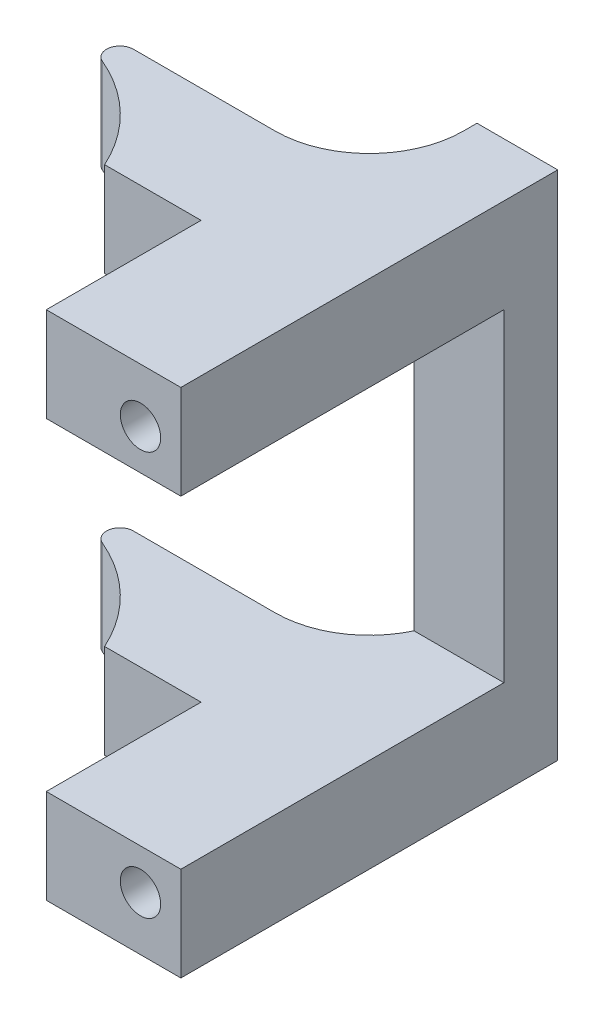
ISO-10303-21;
HEADER;
FILE_DESCRIPTION(('STEP AP214'),'2;1');
FILE_NAME('part.step','',(''),(''),'','','');
FILE_SCHEMA(('AUTOMOTIVE_DESIGN { 1 0 10303 214 1 1 1 1 }'));
ENDSEC;
DATA;
#1=APPLICATION_CONTEXT('core data for automotive mechanical design processes');
#2=APPLICATION_PROTOCOL_DEFINITION('international standard','automotive_design',2000,#1);
#3=PRODUCT_CONTEXT('',#1,'mechanical');
#4=PRODUCT('Part','Part','',(#3));
#5=PRODUCT_RELATED_PRODUCT_CATEGORY('part','',(#4));
#6=PRODUCT_DEFINITION_FORMATION('','',#4);
#7=PRODUCT_DEFINITION_CONTEXT('part definition',#1,'design');
#8=PRODUCT_DEFINITION('design','',#6,#7);
#9=PRODUCT_DEFINITION_SHAPE('','',#8);
#10=(LENGTH_UNIT() NAMED_UNIT(*) SI_UNIT(.MILLI.,.METRE.));
#11=(NAMED_UNIT(*) PLANE_ANGLE_UNIT() SI_UNIT($,.RADIAN.));
#12=(NAMED_UNIT(*) SI_UNIT($,.STERADIAN.) SOLID_ANGLE_UNIT());
#13=UNCERTAINTY_MEASURE_WITH_UNIT(LENGTH_MEASURE(1.E-05),#10,'distance_accuracy_value','');
#14=(GEOMETRIC_REPRESENTATION_CONTEXT(3) GLOBAL_UNCERTAINTY_ASSIGNED_CONTEXT((#13)) GLOBAL_UNIT_ASSIGNED_CONTEXT((#10,
#11,#12)) REPRESENTATION_CONTEXT('',''));
#15=CARTESIAN_POINT('',(0.,0.,0.));
#16=DIRECTION('',(0.,0.,1.));
#17=DIRECTION('',(1.,0.,0.));
#18=AXIS2_PLACEMENT_3D('',#15,#16,#17);
#19=CARTESIAN_POINT('',(2.,34.,10.));
#20=DIRECTION('',(0.,0.,-1.));
#21=DIRECTION('',(1.,0.,0.));
#22=AXIS2_PLACEMENT_3D('',#19,#20,#21);
#23=CYLINDRICAL_SURFACE('',#22,1.5);
#24=CARTESIAN_POINT('',(2.,34.,10.));
#25=DIRECTION('',(0.,0.,1.));
#26=DIRECTION('',(-1.,0.,0.));
#27=AXIS2_PLACEMENT_3D('',#24,#25,#26);
#28=CIRCLE('',#27,1.5);
#29=CARTESIAN_POINT('',(0.499999999999993,34.,10.));
#30=VERTEX_POINT('',#29);
#31=EDGE_CURVE('E292',#30,#30,#28,.T.);
#32=ORIENTED_EDGE('',*,*,#31,.T.);
#33=EDGE_LOOP('',(#32));
#34=FACE_BOUND('',#33,.T.);
#35=CARTESIAN_POINT('',(2.,34.,-17.));
#36=DIRECTION('',(0.,0.,1.));
#37=DIRECTION('',(1.,0.,0.));
#38=AXIS2_PLACEMENT_3D('',#35,#36,#37);
#39=CIRCLE('',#38,1.5);
#40=CARTESIAN_POINT('',(3.5,34.,-17.));
#41=VERTEX_POINT('',#40);
#42=EDGE_CURVE('E41',#41,#41,#39,.F.);
#43=ORIENTED_EDGE('',*,*,#42,.T.);
#44=EDGE_LOOP('',(#43));
#45=FACE_BOUND('',#44,.T.);
#46=ADVANCED_FACE('F37',(#34,#45),#23,.F.);
#47=CARTESIAN_POINT('',(-19.5239351011286,31.,-10.));
#48=DIRECTION('',(0.,1.,0.));
#49=DIRECTION('',(0.,0.,-1.));
#50=AXIS2_PLACEMENT_3D('',#47,#48,#49);
#51=PLANE('',#50);
#52=DIRECTION('',(1.,0.,0.));
#53=VECTOR('',#52,1.);
#54=CARTESIAN_POINT('',(-1.,31.,-14.));
#55=LINE('',#54,#53);
#56=CARTESIAN_POINT('',(-1.67544467966325,31.,-14.));
#57=VERTEX_POINT('',#56);
#58=CARTESIAN_POINT('',(5.,31.,-14.));
#59=VERTEX_POINT('',#58);
#60=EDGE_CURVE('E256',#57,#59,#55,.T.);
#61=ORIENTED_EDGE('',*,*,#60,.T.);
#62=DIRECTION('',(0.,0.,-1.));
#63=VECTOR('',#62,1.);
#64=CARTESIAN_POINT('',(5.,31.,-10.));
#65=LINE('',#64,#63);
#66=CARTESIAN_POINT('',(5.,31.,10.));
#67=VERTEX_POINT('',#66);
#68=EDGE_CURVE('E305',#67,#59,#65,.T.);
#69=ORIENTED_EDGE('',*,*,#68,.F.);
#70=DIRECTION('',(1.,0.,0.));
#71=VECTOR('',#70,1.);
#72=CARTESIAN_POINT('',(-19.5239351011286,31.,10.));
#73=LINE('',#72,#71);
#74=CARTESIAN_POINT('',(-5.,31.,10.));
#75=VERTEX_POINT('',#74);
#76=EDGE_CURVE('E270',#75,#67,#73,.T.);
#77=ORIENTED_EDGE('',*,*,#76,.F.);
#78=DIRECTION('',(0.,0.,-1.));
#79=VECTOR('',#78,1.);
#80=CARTESIAN_POINT('',(-5.,31.,-10.));
#81=LINE('',#80,#79);
#82=CARTESIAN_POINT('',(-5.,31.,-1.5));
#83=VERTEX_POINT('',#82);
#84=EDGE_CURVE('E296',#75,#83,#81,.T.);
#85=ORIENTED_EDGE('',*,*,#84,.T.);
#86=DIRECTION('',(1.,0.,0.));
#87=VECTOR('',#86,1.);
#88=CARTESIAN_POINT('',(-5.,31.,-1.5));
#89=LINE('',#88,#87);
#90=CARTESIAN_POINT('',(-12.1670936190878,31.,-1.5));
#91=VERTEX_POINT('',#90);
#92=EDGE_CURVE('E267',#91,#83,#89,.T.);
#93=ORIENTED_EDGE('',*,*,#92,.F.);
#94=CARTESIAN_POINT('',(-23.999397259488,31.,3.8848482394002));
#95=DIRECTION('',(0.,-1.,0.));
#96=DIRECTION('',(0.,0.,-1.));
#97=AXIS2_PLACEMENT_3D('',#94,#95,#96);
#98=CIRCLE('',#97,13.);
#99=CARTESIAN_POINT('',(-18.9150395410114,31.,-8.0796536971857));
#100=VERTEX_POINT('',#99);
#101=EDGE_CURVE('E271',#100,#91,#98,.T.);
#102=ORIENTED_EDGE('',*,*,#101,.F.);
#103=CARTESIAN_POINT('',(-18.5239351011286,31.,-9.));
#104=DIRECTION('',(0.,-1.,0.));
#105=DIRECTION('',(0.,0.,-1.));
#106=AXIS2_PLACEMENT_3D('',#103,#104,#105);
#107=CIRCLE('',#106,1.);
#108=CARTESIAN_POINT('',(-18.5239351011286,31.,-10.));
#109=VERTEX_POINT('',#108);
#110=EDGE_CURVE('E275',#109,#100,#107,.F.);
#111=ORIENTED_EDGE('',*,*,#110,.F.);
#112=DIRECTION('',(1.,0.,0.));
#113=VECTOR('',#112,1.);
#114=CARTESIAN_POINT('',(-19.5239351011286,31.,-10.));
#115=LINE('',#114,#113);
#116=CARTESIAN_POINT('',(-8.00000000000002,31.,-10.));
#117=VERTEX_POINT('',#116);
#118=EDGE_CURVE('E306',#109,#117,#115,.T.);
#119=ORIENTED_EDGE('',*,*,#118,.T.);
#120=CARTESIAN_POINT('',(-8.00000000000001,31.,-17.));
#121=DIRECTION('',(0.,-1.,0.));
#122=DIRECTION('',(0.,0.,-1.));
#123=AXIS2_PLACEMENT_3D('',#120,#121,#122);
#124=CIRCLE('',#123,7.);
#125=EDGE_CURVE('E46',#57,#117,#124,.T.);
#126=ORIENTED_EDGE('',*,*,#125,.F.);
#127=EDGE_LOOP('',(#61,#69,#77,#85,#93,#102,#111,#119,#126));
#128=FACE_BOUND('',#127,.T.);
#129=ADVANCED_FACE('F365',(#128),#51,.F.);
#130=CARTESIAN_POINT('',(-5.,38.,-10.));
#131=DIRECTION('',(0.,0.,1.));
#132=DIRECTION('',(-1.,0.,0.));
#133=AXIS2_PLACEMENT_3D('',#130,#131,#132);
#134=PLANE('',#133);
#135=ORIENTED_EDGE('',*,*,#118,.F.);
#136=DIRECTION('',(0.,-1.,0.));
#137=VECTOR('',#136,1.);
#138=CARTESIAN_POINT('',(-18.5239351011286,54.8283894304178,-10.));
#139=LINE('',#138,#137);
#140=CARTESIAN_POINT('',(-18.5239351011286,38.,-10.));
#141=VERTEX_POINT('',#140);
#142=EDGE_CURVE('E310',#141,#109,#139,.T.);
#143=ORIENTED_EDGE('',*,*,#142,.F.);
#144=DIRECTION('',(1.,0.,0.));
#145=VECTOR('',#144,1.);
#146=CARTESIAN_POINT('',(-5.,38.,-10.));
#147=LINE('',#146,#145);
#148=CARTESIAN_POINT('',(-8.00000000000001,38.,-10.));
#149=VERTEX_POINT('',#148);
#150=EDGE_CURVE('E272',#141,#149,#147,.T.);
#151=ORIENTED_EDGE('',*,*,#150,.T.);
#152=DIRECTION('',(0.,1.,0.));
#153=VECTOR('',#152,1.);
#154=CARTESIAN_POINT('',(-8.00000000000001,34.5,-10.));
#155=LINE('',#154,#153);
#156=EDGE_CURVE('E324',#117,#149,#155,.T.);
#157=ORIENTED_EDGE('',*,*,#156,.F.);
#158=EDGE_LOOP('',(#135,#143,#151,#157));
#159=FACE_BOUND('',#158,.T.);
#160=ADVANCED_FACE('F371',(#159),#134,.F.);
#161=CARTESIAN_POINT('',(-5.,38.,-10.));
#162=DIRECTION('',(1.,0.,0.));
#163=DIRECTION('',(0.,0.,1.));
#164=AXIS2_PLACEMENT_3D('',#161,#162,#163);
#165=PLANE('',#164);
#166=DIRECTION('',(0.,-1.,0.));
#167=VECTOR('',#166,1.);
#168=CARTESIAN_POINT('',(-5.,38.,10.));
#169=LINE('',#168,#167);
#170=CARTESIAN_POINT('',(-5.,38.,10.));
#171=VERTEX_POINT('',#170);
#172=EDGE_CURVE('E266',#171,#75,#169,.T.);
#173=ORIENTED_EDGE('',*,*,#172,.F.);
#174=DIRECTION('',(0.,0.,-1.));
#175=VECTOR('',#174,1.);
#176=CARTESIAN_POINT('',(-5.,38.,-10.));
#177=LINE('',#176,#175);
#178=CARTESIAN_POINT('',(-5.,38.,-1.5));
#179=VERTEX_POINT('',#178);
#180=EDGE_CURVE('E277',#171,#179,#177,.T.);
#181=ORIENTED_EDGE('',*,*,#180,.T.);
#182=DIRECTION('',(0.,-1.,0.));
#183=VECTOR('',#182,1.);
#184=CARTESIAN_POINT('',(-5.,54.8283894304178,-1.5));
#185=LINE('',#184,#183);
#186=EDGE_CURVE('E286',#179,#83,#185,.T.);
#187=ORIENTED_EDGE('',*,*,#186,.T.);
#188=ORIENTED_EDGE('',*,*,#84,.F.);
#189=EDGE_LOOP('',(#173,#181,#187,#188));
#190=FACE_BOUND('',#189,.T.);
#191=ADVANCED_FACE('F394',(#190),#165,.F.);
#192=CARTESIAN_POINT('',(5.,38.,-10.));
#193=DIRECTION('',(-1.,0.,0.));
#194=DIRECTION('',(0.,0.,-1.));
#195=AXIS2_PLACEMENT_3D('',#192,#193,#194);
#196=PLANE('',#195);
#197=DIRECTION('',(0.,0.,1.));
#198=VECTOR('',#197,1.);
#199=CARTESIAN_POINT('',(5.,38.,-10.));
#200=LINE('',#199,#198);
#201=CARTESIAN_POINT('',(4.99999999999999,38.,-18.));
#202=VERTEX_POINT('',#201);
#203=CARTESIAN_POINT('',(5.,38.,10.));
#204=VERTEX_POINT('',#203);
#205=EDGE_CURVE('E283',#202,#204,#200,.T.);
#206=ORIENTED_EDGE('',*,*,#205,.T.);
#207=DIRECTION('',(0.,-1.,0.));
#208=VECTOR('',#207,1.);
#209=CARTESIAN_POINT('',(5.,38.,10.));
#210=LINE('',#209,#208);
#211=EDGE_CURVE('E295',#204,#67,#210,.T.);
#212=ORIENTED_EDGE('',*,*,#211,.T.);
#213=ORIENTED_EDGE('',*,*,#68,.T.);
#214=DIRECTION('',(0.,1.,0.));
#215=VECTOR('',#214,1.);
#216=CARTESIAN_POINT('',(5.,-0.211102550927982,-14.));
#217=LINE('',#216,#215);
#218=CARTESIAN_POINT('',(5.,6.99999999999999,-14.));
#219=VERTEX_POINT('',#218);
#220=EDGE_CURVE('E259',#219,#59,#217,.T.);
#221=ORIENTED_EDGE('',*,*,#220,.F.);
#222=DIRECTION('',(0.,0.,1.));
#223=VECTOR('',#222,1.);
#224=CARTESIAN_POINT('',(5.,6.99999999999999,-9.99999999999999));
#225=LINE('',#224,#223);
#226=CARTESIAN_POINT('',(5.,7.,10.));
#227=VERTEX_POINT('',#226);
#228=EDGE_CURVE('E179',#219,#227,#225,.T.);
#229=ORIENTED_EDGE('',*,*,#228,.T.);
#230=DIRECTION('',(0.,-1.,0.));
#231=VECTOR('',#230,1.);
#232=CARTESIAN_POINT('',(5.,38.,10.));
#233=LINE('',#232,#231);
#234=CARTESIAN_POINT('',(5.,0.,10.));
#235=VERTEX_POINT('',#234);
#236=EDGE_CURVE('E250',#227,#235,#233,.T.);
#237=ORIENTED_EDGE('',*,*,#236,.T.);
#238=DIRECTION('',(0.,0.,1.));
#239=VECTOR('',#238,1.);
#240=CARTESIAN_POINT('',(5.,0.,-10.));
#241=LINE('',#240,#239);
#242=CARTESIAN_POINT('',(5.,0.,-18.));
#243=VERTEX_POINT('',#242);
#244=EDGE_CURVE('E232',#243,#235,#241,.T.);
#245=ORIENTED_EDGE('',*,*,#244,.F.);
#246=DIRECTION('',(0.,1.,0.));
#247=VECTOR('',#246,1.);
#248=CARTESIAN_POINT('',(4.99999999999999,38.,-18.));
#249=LINE('',#248,#247);
#250=EDGE_CURVE('E188',#243,#202,#249,.T.);
#251=ORIENTED_EDGE('',*,*,#250,.T.);
#252=EDGE_LOOP('',(#206,#212,#213,#221,#229,#237,#245,#251));
#253=FACE_BOUND('',#252,.T.);
#254=ADVANCED_FACE('F398',(#253),#196,.F.);
#255=CARTESIAN_POINT('',(-5.,38.,10.));
#256=DIRECTION('',(0.,0.,-1.));
#257=DIRECTION('',(1.,0.,0.));
#258=AXIS2_PLACEMENT_3D('',#255,#256,#257);
#259=PLANE('',#258);
#260=ORIENTED_EDGE('',*,*,#31,.F.);
#261=EDGE_LOOP('',(#260));
#262=FACE_BOUND('',#261,.T.);
#263=ORIENTED_EDGE('',*,*,#211,.F.);
#264=DIRECTION('',(-1.,0.,0.));
#265=VECTOR('',#264,1.);
#266=CARTESIAN_POINT('',(-5.,38.,10.));
#267=LINE('',#266,#265);
#268=EDGE_CURVE('E281',#204,#171,#267,.T.);
#269=ORIENTED_EDGE('',*,*,#268,.T.);
#270=ORIENTED_EDGE('',*,*,#172,.T.);
#271=ORIENTED_EDGE('',*,*,#76,.T.);
#272=EDGE_LOOP('',(#263,#269,#270,#271));
#273=FACE_BOUND('',#272,.T.);
#274=ADVANCED_FACE('F390',(#262,#273),#259,.F.);
#275=CARTESIAN_POINT('',(-23.999397259488,54.8283894304178,3.8848482394002));
#276=DIRECTION('',(0.,-1.,0.));
#277=DIRECTION('',(0.,0.,1.));
#278=AXIS2_PLACEMENT_3D('',#275,#276,#277);
#279=CYLINDRICAL_SURFACE('',#278,13.);
#280=ORIENTED_EDGE('',*,*,#101,.T.);
#281=DIRECTION('',(0.,-1.,0.));
#282=VECTOR('',#281,1.);
#283=CARTESIAN_POINT('',(-12.1670936190878,54.8283894304178,-1.5));
#284=LINE('',#283,#282);
#285=CARTESIAN_POINT('',(-12.1670936190878,38.,-1.5));
#286=VERTEX_POINT('',#285);
#287=EDGE_CURVE('E309',#286,#91,#284,.T.);
#288=ORIENTED_EDGE('',*,*,#287,.F.);
#289=CARTESIAN_POINT('',(-23.999397259488,38.,3.8848482394002));
#290=DIRECTION('',(0.,1.,0.));
#291=DIRECTION('',(0.,0.,1.));
#292=AXIS2_PLACEMENT_3D('',#289,#290,#291);
#293=CIRCLE('',#292,13.);
#294=CARTESIAN_POINT('',(-18.9150395410114,38.,-8.0796536971857));
#295=VERTEX_POINT('',#294);
#296=EDGE_CURVE('E288',#286,#295,#293,.T.);
#297=ORIENTED_EDGE('',*,*,#296,.T.);
#298=DIRECTION('',(0.,-1.,0.));
#299=VECTOR('',#298,1.);
#300=CARTESIAN_POINT('',(-18.9150395410114,54.8283894304178,-8.0796536971857));
#301=LINE('',#300,#299);
#302=EDGE_CURVE('E316',#295,#100,#301,.T.);
#303=ORIENTED_EDGE('',*,*,#302,.T.);
#304=EDGE_LOOP('',(#280,#288,#297,#303));
#305=FACE_BOUND('',#304,.T.);
#306=ADVANCED_FACE('F383',(#305),#279,.F.);
#307=CARTESIAN_POINT('',(-18.5239351011286,54.8283894304178,-9.));
#308=DIRECTION('',(0.,-1.,0.));
#309=DIRECTION('',(0.,0.,1.));
#310=AXIS2_PLACEMENT_3D('',#307,#308,#309);
#311=CYLINDRICAL_SURFACE('',#310,1.);
#312=ORIENTED_EDGE('',*,*,#110,.T.);
#313=ORIENTED_EDGE('',*,*,#302,.F.);
#314=CARTESIAN_POINT('',(-18.5239351011286,38.,-9.));
#315=DIRECTION('',(0.,1.,0.));
#316=DIRECTION('',(0.,0.,1.));
#317=AXIS2_PLACEMENT_3D('',#314,#315,#316);
#318=CIRCLE('',#317,1.);
#319=EDGE_CURVE('E276',#295,#141,#318,.F.);
#320=ORIENTED_EDGE('',*,*,#319,.T.);
#321=ORIENTED_EDGE('',*,*,#142,.T.);
#322=EDGE_LOOP('',(#312,#313,#320,#321));
#323=FACE_BOUND('',#322,.T.);
#324=ADVANCED_FACE('F379',(#323),#311,.T.);
#325=CARTESIAN_POINT('',(-5.,54.8283894304178,-1.5));
#326=DIRECTION('',(0.,0.,1.));
#327=DIRECTION('',(-1.,0.,0.));
#328=AXIS2_PLACEMENT_3D('',#325,#326,#327);
#329=PLANE('',#328);
#330=ORIENTED_EDGE('',*,*,#92,.T.);
#331=ORIENTED_EDGE('',*,*,#186,.F.);
#332=DIRECTION('',(-1.,0.,0.));
#333=VECTOR('',#332,1.);
#334=CARTESIAN_POINT('',(-5.,38.,-1.5));
#335=LINE('',#334,#333);
#336=EDGE_CURVE('E280',#179,#286,#335,.T.);
#337=ORIENTED_EDGE('',*,*,#336,.T.);
#338=ORIENTED_EDGE('',*,*,#287,.T.);
#339=EDGE_LOOP('',(#330,#331,#337,#338));
#340=FACE_BOUND('',#339,.T.);
#341=ADVANCED_FACE('F382',(#340),#329,.T.);
#342=CARTESIAN_POINT('',(0.,38.,0.));
#343=DIRECTION('',(0.,-1.,0.));
#344=DIRECTION('',(0.,0.,1.));
#345=AXIS2_PLACEMENT_3D('',#342,#343,#344);
#346=PLANE('',#345);
#347=ORIENTED_EDGE('',*,*,#205,.F.);
#348=DIRECTION('',(-1.,0.,0.));
#349=VECTOR('',#348,1.);
#350=CARTESIAN_POINT('',(4.99999999999999,38.,-18.));
#351=LINE('',#350,#349);
#352=CARTESIAN_POINT('',(-1.00000000000001,38.,-18.));
#353=VERTEX_POINT('',#352);
#354=EDGE_CURVE('E189',#202,#353,#351,.T.);
#355=ORIENTED_EDGE('',*,*,#354,.T.);
#356=DIRECTION('',(0.,0.,1.));
#357=VECTOR('',#356,1.);
#358=CARTESIAN_POINT('',(-1.00000000000001,38.,-18.));
#359=LINE('',#358,#357);
#360=CARTESIAN_POINT('',(-1.00000000000001,38.,-17.));
#361=VERTEX_POINT('',#360);
#362=EDGE_CURVE('E185',#353,#361,#359,.T.);
#363=ORIENTED_EDGE('',*,*,#362,.T.);
#364=CARTESIAN_POINT('',(-8.00000000000001,38.,-17.));
#365=DIRECTION('',(0.,1.,0.));
#366=DIRECTION('',(0.,0.,1.));
#367=AXIS2_PLACEMENT_3D('',#364,#365,#366);
#368=CIRCLE('',#367,7.);
#369=EDGE_CURVE('E11',#149,#361,#368,.T.);
#370=ORIENTED_EDGE('',*,*,#369,.F.);
#371=ORIENTED_EDGE('',*,*,#150,.F.);
#372=ORIENTED_EDGE('',*,*,#319,.F.);
#373=ORIENTED_EDGE('',*,*,#296,.F.);
#374=ORIENTED_EDGE('',*,*,#336,.F.);
#375=ORIENTED_EDGE('',*,*,#180,.F.);
#376=ORIENTED_EDGE('',*,*,#268,.F.);
#377=EDGE_LOOP('',(#347,#355,#363,#370,#371,#372,#373,#374,#375,#376));
#378=FACE_BOUND('',#377,.T.);
#379=ADVANCED_FACE('F376',(#378),#346,.F.);
#380=CARTESIAN_POINT('',(0.,0.,-18.));
#381=DIRECTION('',(0.,0.,-1.));
#382=DIRECTION('',(1.,0.,0.));
#383=AXIS2_PLACEMENT_3D('',#380,#381,#382);
#384=PLANE('',#383);
#385=CARTESIAN_POINT('',(1.99999999999999,34.,-18.));
#386=DIRECTION('',(0.,0.,1.));
#387=DIRECTION('',(1.,0.,0.));
#388=AXIS2_PLACEMENT_3D('',#385,#386,#387);
#389=CIRCLE('',#388,2.5);
#390=CARTESIAN_POINT('',(4.49999999999999,34.,-18.));
#391=VERTEX_POINT('',#390);
#392=EDGE_CURVE('E335',#391,#391,#389,.T.);
#393=ORIENTED_EDGE('',*,*,#392,.T.);
#394=EDGE_LOOP('',(#393));
#395=FACE_BOUND('',#394,.T.);
#396=CARTESIAN_POINT('',(1.99999999999999,4.,-18.));
#397=DIRECTION('',(0.,0.,1.));
#398=DIRECTION('',(-1.,0.,0.));
#399=AXIS2_PLACEMENT_3D('',#396,#397,#398);
#400=CIRCLE('',#399,2.5);
#401=CARTESIAN_POINT('',(-0.500000000000013,4.,-18.));
#402=VERTEX_POINT('',#401);
#403=EDGE_CURVE('E198',#402,#402,#400,.T.);
#404=ORIENTED_EDGE('',*,*,#403,.T.);
#405=EDGE_LOOP('',(#404));
#406=FACE_BOUND('',#405,.T.);
#407=ORIENTED_EDGE('',*,*,#354,.F.);
#408=ORIENTED_EDGE('',*,*,#250,.F.);
#409=DIRECTION('',(1.,0.,0.));
#410=VECTOR('',#409,1.);
#411=CARTESIAN_POINT('',(5.,0.,-18.));
#412=LINE('',#411,#410);
#413=CARTESIAN_POINT('',(-1.,0.,-18.));
#414=VERTEX_POINT('',#413);
#415=EDGE_CURVE('E173',#414,#243,#412,.T.);
#416=ORIENTED_EDGE('',*,*,#415,.F.);
#417=DIRECTION('',(0.,-1.,0.));
#418=VECTOR('',#417,1.);
#419=CARTESIAN_POINT('',(-1.00000000000001,38.,-18.));
#420=LINE('',#419,#418);
#421=EDGE_CURVE('E182',#353,#414,#420,.T.);
#422=ORIENTED_EDGE('',*,*,#421,.F.);
#423=EDGE_LOOP('',(#407,#408,#416,#422));
#424=FACE_BOUND('',#423,.T.);
#425=ADVANCED_FACE('F191',(#395,#406,#424),#384,.T.);
#426=CARTESIAN_POINT('',(-1.00000000000001,38.,-18.));
#427=DIRECTION('',(1.,0.,0.));
#428=DIRECTION('',(0.,0.,1.));
#429=AXIS2_PLACEMENT_3D('',#426,#427,#428);
#430=PLANE('',#429);
#431=ORIENTED_EDGE('',*,*,#362,.F.);
#432=ORIENTED_EDGE('',*,*,#421,.T.);
#433=DIRECTION('',(0.,0.,1.));
#434=VECTOR('',#433,1.);
#435=CARTESIAN_POINT('',(-1.,0.,-18.));
#436=LINE('',#435,#434);
#437=CARTESIAN_POINT('',(-1.,0.,-17.));
#438=VERTEX_POINT('',#437);
#439=EDGE_CURVE('E168',#414,#438,#436,.T.);
#440=ORIENTED_EDGE('',*,*,#439,.T.);
#441=DIRECTION('',(0.,-1.,0.));
#442=VECTOR('',#441,1.);
#443=CARTESIAN_POINT('',(-1.00000000000001,0.,-17.));
#444=LINE('',#443,#442);
#445=EDGE_CURVE('E313',#361,#438,#444,.T.);
#446=ORIENTED_EDGE('',*,*,#445,.F.);
#447=EDGE_LOOP('',(#431,#432,#440,#446));
#448=FACE_BOUND('',#447,.T.);
#449=ADVANCED_FACE('F183',(#448),#430,.F.);
#450=CARTESIAN_POINT('',(-1.,-0.211102550927982,-14.));
#451=DIRECTION('',(0.,0.,-1.));
#452=DIRECTION('',(0.,-1.,0.));
#453=AXIS2_PLACEMENT_3D('',#450,#451,#452);
#454=PLANE('',#453);
#455=DIRECTION('',(1.,0.,0.));
#456=VECTOR('',#455,1.);
#457=CARTESIAN_POINT('',(-1.,6.99999999999999,-14.));
#458=LINE('',#457,#456);
#459=CARTESIAN_POINT('',(-1.67544467966325,6.99999999999999,-14.));
#460=VERTEX_POINT('',#459);
#461=EDGE_CURVE('E260',#460,#219,#458,.T.);
#462=ORIENTED_EDGE('',*,*,#461,.T.);
#463=ORIENTED_EDGE('',*,*,#220,.T.);
#464=ORIENTED_EDGE('',*,*,#60,.F.);
#465=DIRECTION('',(0.,1.,0.));
#466=VECTOR('',#465,1.);
#467=CARTESIAN_POINT('',(-1.67544467966325,6.99999999999999,-14.));
#468=LINE('',#467,#466);
#469=EDGE_CURVE('E54',#460,#57,#468,.T.);
#470=ORIENTED_EDGE('',*,*,#469,.F.);
#471=EDGE_LOOP('',(#462,#463,#464,#470));
#472=FACE_BOUND('',#471,.T.);
#473=ADVANCED_FACE('F428',(#472),#454,.F.);
#474=CARTESIAN_POINT('',(-19.5239351011286,6.99999999999999,-9.99999999999999));
#475=DIRECTION('',(0.,-1.,0.));
#476=DIRECTION('',(0.,0.,1.));
#477=AXIS2_PLACEMENT_3D('',#474,#475,#476);
#478=PLANE('',#477);
#479=DIRECTION('',(1.,0.,0.));
#480=VECTOR('',#479,1.);
#481=CARTESIAN_POINT('',(-19.5239351011286,6.99999999999999,-9.99999999999999));
#482=LINE('',#481,#480);
#483=CARTESIAN_POINT('',(-18.5239351011286,6.99999999999999,-9.99999999999999));
#484=VERTEX_POINT('',#483);
#485=CARTESIAN_POINT('',(-8.00000000000002,6.99999999999999,-9.99999999999999));
#486=VERTEX_POINT('',#485);
#487=EDGE_CURVE('E203',#484,#486,#482,.T.);
#488=ORIENTED_EDGE('',*,*,#487,.F.);
#489=CARTESIAN_POINT('',(-18.5239351011286,6.99999999999999,-9.));
#490=DIRECTION('',(0.,1.,0.));
#491=DIRECTION('',(0.,0.,1.));
#492=AXIS2_PLACEMENT_3D('',#489,#490,#491);
#493=CIRCLE('',#492,1.);
#494=CARTESIAN_POINT('',(-18.9150395410114,6.99999999999999,-8.0796536971857));
#495=VERTEX_POINT('',#494);
#496=EDGE_CURVE('E214',#495,#484,#493,.F.);
#497=ORIENTED_EDGE('',*,*,#496,.F.);
#498=CARTESIAN_POINT('',(-23.999397259488,6.99999999999999,3.8848482394002));
#499=DIRECTION('',(0.,1.,0.));
#500=DIRECTION('',(0.,0.,1.));
#501=AXIS2_PLACEMENT_3D('',#498,#499,#500);
#502=CIRCLE('',#501,13.);
#503=CARTESIAN_POINT('',(-12.1670936190878,6.99999999999999,-1.5));
#504=VERTEX_POINT('',#503);
#505=EDGE_CURVE('E206',#504,#495,#502,.T.);
#506=ORIENTED_EDGE('',*,*,#505,.F.);
#507=DIRECTION('',(-1.,0.,0.));
#508=VECTOR('',#507,1.);
#509=CARTESIAN_POINT('',(-5.,6.99999999999999,-1.5));
#510=LINE('',#509,#508);
#511=CARTESIAN_POINT('',(-5.,7.00000000000001,-1.5));
#512=VERTEX_POINT('',#511);
#513=EDGE_CURVE('E253',#512,#504,#510,.T.);
#514=ORIENTED_EDGE('',*,*,#513,.F.);
#515=DIRECTION('',(0.,0.,1.));
#516=VECTOR('',#515,1.);
#517=CARTESIAN_POINT('',(-5.,6.99999999999999,-10.));
#518=LINE('',#517,#516);
#519=CARTESIAN_POINT('',(-5.,7.,10.));
#520=VERTEX_POINT('',#519);
#521=EDGE_CURVE('E211',#512,#520,#518,.T.);
#522=ORIENTED_EDGE('',*,*,#521,.T.);
#523=DIRECTION('',(1.,0.,0.));
#524=VECTOR('',#523,1.);
#525=CARTESIAN_POINT('',(-19.5239351011286,7.,10.));
#526=LINE('',#525,#524);
#527=EDGE_CURVE('E204',#520,#227,#526,.T.);
#528=ORIENTED_EDGE('',*,*,#527,.T.);
#529=ORIENTED_EDGE('',*,*,#228,.F.);
#530=ORIENTED_EDGE('',*,*,#461,.F.);
#531=CARTESIAN_POINT('',(-8.00000000000001,6.99999999999999,-17.));
#532=DIRECTION('',(0.,1.,0.));
#533=DIRECTION('',(0.,0.,1.));
#534=AXIS2_PLACEMENT_3D('',#531,#532,#533);
#535=CIRCLE('',#534,7.);
#536=EDGE_CURVE('E59',#486,#460,#535,.T.);
#537=ORIENTED_EDGE('',*,*,#536,.F.);
#538=EDGE_LOOP('',(#488,#497,#506,#514,#522,#528,#529,#530,#537));
#539=FACE_BOUND('',#538,.T.);
#540=ADVANCED_FACE('F433',(#539),#478,.F.);
#541=CARTESIAN_POINT('',(-5.,38.,-10.));
#542=DIRECTION('',(0.,0.,1.));
#543=DIRECTION('',(-1.,0.,0.));
#544=AXIS2_PLACEMENT_3D('',#541,#542,#543);
#545=PLANE('',#544);
#546=DIRECTION('',(1.,0.,0.));
#547=VECTOR('',#546,1.);
#548=CARTESIAN_POINT('',(-5.,0.,-10.));
#549=LINE('',#548,#547);
#550=CARTESIAN_POINT('',(-18.5239351011286,0.,-10.));
#551=VERTEX_POINT('',#550);
#552=CARTESIAN_POINT('',(-8.00000000000001,0.,-10.));
#553=VERTEX_POINT('',#552);
#554=EDGE_CURVE('E246',#551,#553,#549,.T.);
#555=ORIENTED_EDGE('',*,*,#554,.F.);
#556=DIRECTION('',(0.,-1.,0.));
#557=VECTOR('',#556,1.);
#558=CARTESIAN_POINT('',(-18.5239351011286,54.8283894304178,-10.));
#559=LINE('',#558,#557);
#560=EDGE_CURVE('E233',#484,#551,#559,.T.);
#561=ORIENTED_EDGE('',*,*,#560,.F.);
#562=ORIENTED_EDGE('',*,*,#487,.T.);
#563=DIRECTION('',(0.,-1.,0.));
#564=VECTOR('',#563,1.);
#565=CARTESIAN_POINT('',(-8.00000000000001,6.99999999999999,-10.));
#566=LINE('',#565,#564);
#567=EDGE_CURVE('E322',#553,#486,#566,.F.);
#568=ORIENTED_EDGE('',*,*,#567,.F.);
#569=EDGE_LOOP('',(#555,#561,#562,#568));
#570=FACE_BOUND('',#569,.T.);
#571=ADVANCED_FACE('F456',(#570),#545,.F.);
#572=CARTESIAN_POINT('',(2.,4.,10.));
#573=DIRECTION('',(0.,0.,-1.));
#574=DIRECTION('',(1.,0.,0.));
#575=AXIS2_PLACEMENT_3D('',#572,#573,#574);
#576=CYLINDRICAL_SURFACE('',#575,1.5);
#577=CARTESIAN_POINT('',(2.,4.,-17.));
#578=DIRECTION('',(0.,0.,-1.));
#579=DIRECTION('',(-1.,0.,0.));
#580=AXIS2_PLACEMENT_3D('',#577,#578,#579);
#581=CIRCLE('',#580,1.5);
#582=CARTESIAN_POINT('',(0.5,4.,-17.));
#583=VERTEX_POINT('',#582);
#584=EDGE_CURVE('E196',#583,#583,#581,.F.);
#585=ORIENTED_EDGE('',*,*,#584,.F.);
#586=EDGE_LOOP('',(#585));
#587=FACE_BOUND('',#586,.T.);
#588=CARTESIAN_POINT('',(2.,4.,10.));
#589=DIRECTION('',(0.,0.,1.));
#590=DIRECTION('',(1.,0.,0.));
#591=AXIS2_PLACEMENT_3D('',#588,#589,#590);
#592=CIRCLE('',#591,1.5);
#593=CARTESIAN_POINT('',(3.5,4.,10.));
#594=VERTEX_POINT('',#593);
#595=EDGE_CURVE('E217',#594,#594,#592,.T.);
#596=ORIENTED_EDGE('',*,*,#595,.T.);
#597=EDGE_LOOP('',(#596));
#598=FACE_BOUND('',#597,.T.);
#599=ADVANCED_FACE('F458',(#587,#598),#576,.F.);
#600=CARTESIAN_POINT('',(0.,0.,0.));
#601=DIRECTION('',(0.,-1.,0.));
#602=DIRECTION('',(0.,0.,1.));
#603=AXIS2_PLACEMENT_3D('',#600,#601,#602);
#604=PLANE('',#603);
#605=ORIENTED_EDGE('',*,*,#244,.T.);
#606=DIRECTION('',(-1.,0.,0.));
#607=VECTOR('',#606,1.);
#608=CARTESIAN_POINT('',(-5.,0.,10.));
#609=LINE('',#608,#607);
#610=CARTESIAN_POINT('',(-5.,0.,10.));
#611=VERTEX_POINT('',#610);
#612=EDGE_CURVE('E240',#235,#611,#609,.T.);
#613=ORIENTED_EDGE('',*,*,#612,.T.);
#614=DIRECTION('',(0.,0.,-1.));
#615=VECTOR('',#614,1.);
#616=CARTESIAN_POINT('',(-5.,0.,-10.));
#617=LINE('',#616,#615);
#618=CARTESIAN_POINT('',(-5.,0.,-1.5));
#619=VERTEX_POINT('',#618);
#620=EDGE_CURVE('E243',#611,#619,#617,.T.);
#621=ORIENTED_EDGE('',*,*,#620,.T.);
#622=DIRECTION('',(1.,0.,0.));
#623=VECTOR('',#622,1.);
#624=CARTESIAN_POINT('',(-5.,0.,-1.5));
#625=LINE('',#624,#623);
#626=CARTESIAN_POINT('',(-12.1670936190878,0.,-1.5));
#627=VERTEX_POINT('',#626);
#628=EDGE_CURVE('E223',#627,#619,#625,.T.);
#629=ORIENTED_EDGE('',*,*,#628,.F.);
#630=CARTESIAN_POINT('',(-23.999397259488,0.,3.8848482394002));
#631=DIRECTION('',(0.,-1.,0.));
#632=DIRECTION('',(0.,0.,1.));
#633=AXIS2_PLACEMENT_3D('',#630,#631,#632);
#634=CIRCLE('',#633,13.);
#635=CARTESIAN_POINT('',(-18.9150395410114,0.,-8.0796536971857));
#636=VERTEX_POINT('',#635);
#637=EDGE_CURVE('E220',#636,#627,#634,.T.);
#638=ORIENTED_EDGE('',*,*,#637,.F.);
#639=CARTESIAN_POINT('',(-18.5239351011286,0.,-9.));
#640=DIRECTION('',(0.,1.,0.));
#641=DIRECTION('',(0.,0.,1.));
#642=AXIS2_PLACEMENT_3D('',#639,#640,#641);
#643=CIRCLE('',#642,1.);
#644=EDGE_CURVE('E226',#551,#636,#643,.T.);
#645=ORIENTED_EDGE('',*,*,#644,.F.);
#646=ORIENTED_EDGE('',*,*,#554,.T.);
#647=CARTESIAN_POINT('',(-8.00000000000001,0.,-17.));
#648=DIRECTION('',(0.,1.,0.));
#649=DIRECTION('',(0.,0.,1.));
#650=AXIS2_PLACEMENT_3D('',#647,#648,#649);
#651=CIRCLE('',#650,7.);
#652=EDGE_CURVE('E176',#438,#553,#651,.F.);
#653=ORIENTED_EDGE('',*,*,#652,.F.);
#654=ORIENTED_EDGE('',*,*,#439,.F.);
#655=ORIENTED_EDGE('',*,*,#415,.T.);
#656=EDGE_LOOP('',(#605,#613,#621,#629,#638,#645,#646,#653,#654,#655));
#657=FACE_BOUND('',#656,.T.);
#658=ADVANCED_FACE('F171',(#657),#604,.T.);
#659=CARTESIAN_POINT('',(-18.5239351011286,54.8283894304178,-9.));
#660=DIRECTION('',(0.,-1.,0.));
#661=DIRECTION('',(0.,0.,1.));
#662=AXIS2_PLACEMENT_3D('',#659,#660,#661);
#663=CYLINDRICAL_SURFACE('',#662,1.);
#664=ORIENTED_EDGE('',*,*,#496,.T.);
#665=ORIENTED_EDGE('',*,*,#560,.T.);
#666=ORIENTED_EDGE('',*,*,#644,.T.);
#667=DIRECTION('',(0.,-1.,0.));
#668=VECTOR('',#667,1.);
#669=CARTESIAN_POINT('',(-18.9150395410114,54.8283894304178,-8.0796536971857));
#670=LINE('',#669,#668);
#671=EDGE_CURVE('E230',#495,#636,#670,.T.);
#672=ORIENTED_EDGE('',*,*,#671,.F.);
#673=EDGE_LOOP('',(#664,#665,#666,#672));
#674=FACE_BOUND('',#673,.T.);
#675=ADVANCED_FACE('F452',(#674),#663,.T.);
#676=CARTESIAN_POINT('',(-5.,54.8283894304178,-1.5));
#677=DIRECTION('',(0.,0.,1.));
#678=DIRECTION('',(-1.,0.,0.));
#679=AXIS2_PLACEMENT_3D('',#676,#677,#678);
#680=PLANE('',#679);
#681=ORIENTED_EDGE('',*,*,#513,.T.);
#682=DIRECTION('',(0.,-1.,0.));
#683=VECTOR('',#682,1.);
#684=CARTESIAN_POINT('',(-12.1670936190878,54.8283894304178,-1.5));
#685=LINE('',#684,#683);
#686=EDGE_CURVE('E229',#504,#627,#685,.T.);
#687=ORIENTED_EDGE('',*,*,#686,.T.);
#688=ORIENTED_EDGE('',*,*,#628,.T.);
#689=DIRECTION('',(0.,-1.,0.));
#690=VECTOR('',#689,1.);
#691=CARTESIAN_POINT('',(-5.,54.8283894304178,-1.5));
#692=LINE('',#691,#690);
#693=EDGE_CURVE('E236',#512,#619,#692,.T.);
#694=ORIENTED_EDGE('',*,*,#693,.F.);
#695=EDGE_LOOP('',(#681,#687,#688,#694));
#696=FACE_BOUND('',#695,.T.);
#697=ADVANCED_FACE('F446',(#696),#680,.T.);
#698=CARTESIAN_POINT('',(-23.999397259488,54.8283894304178,3.8848482394002));
#699=DIRECTION('',(0.,-1.,0.));
#700=DIRECTION('',(0.,0.,1.));
#701=AXIS2_PLACEMENT_3D('',#698,#699,#700);
#702=CYLINDRICAL_SURFACE('',#701,13.);
#703=ORIENTED_EDGE('',*,*,#505,.T.);
#704=ORIENTED_EDGE('',*,*,#671,.T.);
#705=ORIENTED_EDGE('',*,*,#637,.T.);
#706=ORIENTED_EDGE('',*,*,#686,.F.);
#707=EDGE_LOOP('',(#703,#704,#705,#706));
#708=FACE_BOUND('',#707,.T.);
#709=ADVANCED_FACE('F449',(#708),#702,.F.);
#710=CARTESIAN_POINT('',(-5.,38.,10.));
#711=DIRECTION('',(0.,0.,-1.));
#712=DIRECTION('',(1.,0.,0.));
#713=AXIS2_PLACEMENT_3D('',#710,#711,#712);
#714=PLANE('',#713);
#715=ORIENTED_EDGE('',*,*,#595,.F.);
#716=EDGE_LOOP('',(#715));
#717=FACE_BOUND('',#716,.T.);
#718=DIRECTION('',(0.,-1.,0.));
#719=VECTOR('',#718,1.);
#720=CARTESIAN_POINT('',(-5.,38.,10.));
#721=LINE('',#720,#719);
#722=EDGE_CURVE('E248',#520,#611,#721,.T.);
#723=ORIENTED_EDGE('',*,*,#722,.T.);
#724=ORIENTED_EDGE('',*,*,#612,.F.);
#725=ORIENTED_EDGE('',*,*,#236,.F.);
#726=ORIENTED_EDGE('',*,*,#527,.F.);
#727=EDGE_LOOP('',(#723,#724,#725,#726));
#728=FACE_BOUND('',#727,.T.);
#729=ADVANCED_FACE('F437',(#717,#728),#714,.F.);
#730=CARTESIAN_POINT('',(-5.,38.,-10.));
#731=DIRECTION('',(1.,0.,0.));
#732=DIRECTION('',(0.,0.,1.));
#733=AXIS2_PLACEMENT_3D('',#730,#731,#732);
#734=PLANE('',#733);
#735=ORIENTED_EDGE('',*,*,#693,.T.);
#736=ORIENTED_EDGE('',*,*,#620,.F.);
#737=ORIENTED_EDGE('',*,*,#722,.F.);
#738=ORIENTED_EDGE('',*,*,#521,.F.);
#739=EDGE_LOOP('',(#735,#736,#737,#738));
#740=FACE_BOUND('',#739,.T.);
#741=ADVANCED_FACE('F442',(#740),#734,.F.);
#742=CARTESIAN_POINT('',(-8.00000000000001,38.,-17.));
#743=DIRECTION('',(0.,1.,0.));
#744=DIRECTION('',(0.,0.,-1.));
#745=AXIS2_PLACEMENT_3D('',#742,#743,#744);
#746=CYLINDRICAL_SURFACE('',#745,7.);
#747=ORIENTED_EDGE('',*,*,#536,.T.);
#748=ORIENTED_EDGE('',*,*,#469,.T.);
#749=ORIENTED_EDGE('',*,*,#125,.T.);
#750=ORIENTED_EDGE('',*,*,#156,.T.);
#751=ORIENTED_EDGE('',*,*,#369,.T.);
#752=ORIENTED_EDGE('',*,*,#445,.T.);
#753=ORIENTED_EDGE('',*,*,#652,.T.);
#754=ORIENTED_EDGE('',*,*,#567,.T.);
#755=EDGE_LOOP('',(#747,#748,#749,#750,#751,#752,#753,#754));
#756=FACE_BOUND('',#755,.T.);
#757=ADVANCED_FACE('F39',(#756),#746,.F.);
#758=CARTESIAN_POINT('',(1.99999999999999,4.,-17.));
#759=DIRECTION('',(0.,0.,1.));
#760=DIRECTION('',(-1.,0.,0.));
#761=AXIS2_PLACEMENT_3D('',#758,#759,#760);
#762=PLANE('',#761);
#763=CARTESIAN_POINT('',(1.99999999999999,4.,-17.));
#764=DIRECTION('',(0.,0.,1.));
#765=DIRECTION('',(-1.,0.,0.));
#766=AXIS2_PLACEMENT_3D('',#763,#764,#765);
#767=CIRCLE('',#766,2.5);
#768=CARTESIAN_POINT('',(-0.500000000000013,4.,-17.));
#769=VERTEX_POINT('',#768);
#770=EDGE_CURVE('E340',#769,#769,#767,.T.);
#771=ORIENTED_EDGE('',*,*,#770,.F.);
#772=EDGE_LOOP('',(#771));
#773=FACE_BOUND('',#772,.T.);
#774=ORIENTED_EDGE('',*,*,#584,.T.);
#775=EDGE_LOOP('',(#774));
#776=FACE_BOUND('',#775,.T.);
#777=ADVANCED_FACE('F352',(#773,#776),#762,.F.);
#778=CARTESIAN_POINT('',(1.99999999999999,4.,-17.));
#779=DIRECTION('',(0.,0.,-1.));
#780=DIRECTION('',(1.,0.,0.));
#781=AXIS2_PLACEMENT_3D('',#778,#779,#780);
#782=CYLINDRICAL_SURFACE('',#781,2.5);
#783=ORIENTED_EDGE('',*,*,#770,.T.);
#784=EDGE_LOOP('',(#783));
#785=FACE_BOUND('',#784,.T.);
#786=ORIENTED_EDGE('',*,*,#403,.F.);
#787=EDGE_LOOP('',(#786));
#788=FACE_BOUND('',#787,.T.);
#789=ADVANCED_FACE('F349',(#785,#788),#782,.F.);
#790=CARTESIAN_POINT('',(1.99999999999999,34.,-17.));
#791=DIRECTION('',(0.,0.,-1.));
#792=DIRECTION('',(1.,0.,0.));
#793=AXIS2_PLACEMENT_3D('',#790,#791,#792);
#794=PLANE('',#793);
#795=CARTESIAN_POINT('',(1.99999999999999,34.,-17.));
#796=DIRECTION('',(0.,0.,1.));
#797=DIRECTION('',(1.,0.,0.));
#798=AXIS2_PLACEMENT_3D('',#795,#796,#797);
#799=CIRCLE('',#798,2.5);
#800=CARTESIAN_POINT('',(4.49999999999999,34.,-17.));
#801=VERTEX_POINT('',#800);
#802=EDGE_CURVE('E331',#801,#801,#799,.T.);
#803=ORIENTED_EDGE('',*,*,#802,.F.);
#804=EDGE_LOOP('',(#803));
#805=FACE_BOUND('',#804,.T.);
#806=ORIENTED_EDGE('',*,*,#42,.F.);
#807=EDGE_LOOP('',(#806));
#808=FACE_BOUND('',#807,.T.);
#809=ADVANCED_FACE('F351',(#805,#808),#794,.T.);
#810=CARTESIAN_POINT('',(1.99999999999999,34.,-17.));
#811=DIRECTION('',(0.,0.,-1.));
#812=DIRECTION('',(1.,0.,0.));
#813=AXIS2_PLACEMENT_3D('',#810,#811,#812);
#814=CYLINDRICAL_SURFACE('',#813,2.5);
#815=ORIENTED_EDGE('',*,*,#802,.T.);
#816=EDGE_LOOP('',(#815));
#817=FACE_BOUND('',#816,.T.);
#818=ORIENTED_EDGE('',*,*,#392,.F.);
#819=EDGE_LOOP('',(#818));
#820=FACE_BOUND('',#819,.T.);
#821=ADVANCED_FACE('F358',(#817,#820),#814,.F.);
#822=CLOSED_SHELL('',(#46,#129,#160,#191,#254,#274,#306,#324,#341,#379,#425,#449,#473,#540,#571,
#599,#658,#675,#697,#709,#729,#741,#757,#777,#789,#809,#821));
#823=MANIFOLD_SOLID_BREP('B2',#822);
#824=ADVANCED_BREP_SHAPE_REPRESENTATION('',(#18,#823),#14);
#825=SHAPE_DEFINITION_REPRESENTATION(#9,#824);
ENDSEC;
END-ISO-10303-21;
